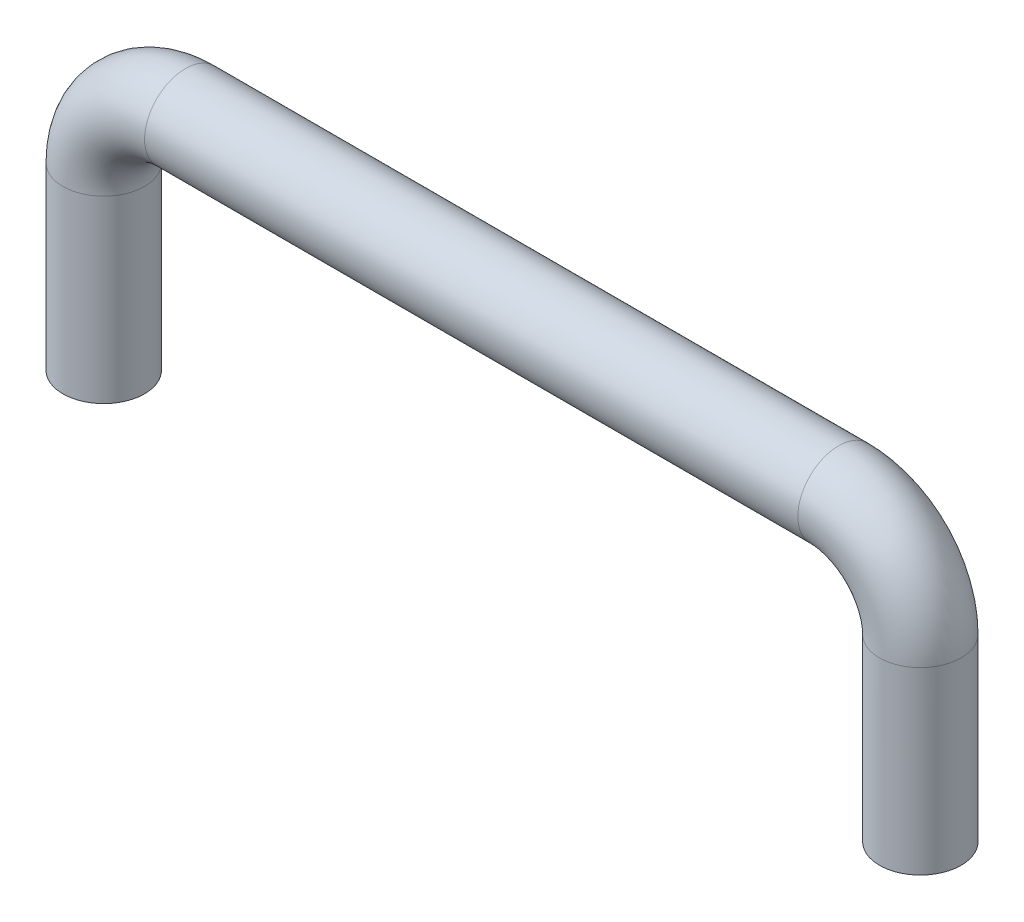
ISO-10303-21;
HEADER;
FILE_DESCRIPTION(('STEP AP214'),'2;1');
FILE_NAME('part.step','',(''),(''),'','','');
FILE_SCHEMA(('AUTOMOTIVE_DESIGN { 1 0 10303 214 1 1 1 1 }'));
ENDSEC;
DATA;
#1=APPLICATION_CONTEXT('core data for automotive mechanical design processes');
#2=APPLICATION_PROTOCOL_DEFINITION('international standard','automotive_design',2000,#1);
#3=PRODUCT_CONTEXT('',#1,'mechanical');
#4=PRODUCT('Part','Part','',(#3));
#5=PRODUCT_RELATED_PRODUCT_CATEGORY('part','',(#4));
#6=PRODUCT_DEFINITION_FORMATION('','',#4);
#7=PRODUCT_DEFINITION_CONTEXT('part definition',#1,'design');
#8=PRODUCT_DEFINITION('design','',#6,#7);
#9=PRODUCT_DEFINITION_SHAPE('','',#8);
#10=(LENGTH_UNIT() NAMED_UNIT(*) SI_UNIT(.MILLI.,.METRE.));
#11=(NAMED_UNIT(*) PLANE_ANGLE_UNIT() SI_UNIT($,.RADIAN.));
#12=(NAMED_UNIT(*) SI_UNIT($,.STERADIAN.) SOLID_ANGLE_UNIT());
#13=UNCERTAINTY_MEASURE_WITH_UNIT(LENGTH_MEASURE(1.E-05),#10,'distance_accuracy_value','');
#14=(GEOMETRIC_REPRESENTATION_CONTEXT(3) GLOBAL_UNCERTAINTY_ASSIGNED_CONTEXT((#13)) GLOBAL_UNIT_ASSIGNED_CONTEXT((#10,
#11,#12)) REPRESENTATION_CONTEXT('',''));
#15=CARTESIAN_POINT('',(0.,0.,0.));
#16=DIRECTION('',(0.,0.,1.));
#17=DIRECTION('',(1.,0.,0.));
#18=AXIS2_PLACEMENT_3D('',#15,#16,#17);
#19=CARTESIAN_POINT('',(105.,0.,0.));
#20=DIRECTION('',(0.,1.,0.));
#21=DIRECTION('',(1.,0.,0.));
#22=AXIS2_PLACEMENT_3D('',#19,#20,#21);
#23=PLANE('',#22);
#24=CARTESIAN_POINT('',(100.,0.,0.));
#25=DIRECTION('',(0.,-1.,0.));
#26=DIRECTION('',(0.,0.,-1.));
#27=AXIS2_PLACEMENT_3D('',#24,#25,#26);
#28=CIRCLE('',#27,5.);
#29=CARTESIAN_POINT('',(100.,0.,-5.));
#30=VERTEX_POINT('',#29);
#31=EDGE_CURVE('E11',#30,#30,#28,.T.);
#32=ORIENTED_EDGE('',*,*,#31,.T.);
#33=EDGE_LOOP('',(#32));
#34=FACE_BOUND('',#33,.T.);
#35=ADVANCED_FACE('F17',(#34),#23,.F.);
#36=CARTESIAN_POINT('',(100.,0.,0.));
#37=DIRECTION('',(0.,-1.,0.));
#38=DIRECTION('',(0.,0.,-1.));
#39=AXIS2_PLACEMENT_3D('',#36,#37,#38);
#40=CYLINDRICAL_SURFACE('',#39,5.);
#41=CARTESIAN_POINT('',(100.,22.,0.));
#42=DIRECTION('',(0.,1.,0.));
#43=DIRECTION('',(1.,0.,0.));
#44=AXIS2_PLACEMENT_3D('',#41,#42,#43);
#45=CIRCLE('',#44,5.);
#46=CARTESIAN_POINT('',(105.,22.,0.));
#47=VERTEX_POINT('',#46);
#48=EDGE_CURVE('E25',#47,#47,#45,.T.);
#49=ORIENTED_EDGE('',*,*,#48,.F.);
#50=EDGE_LOOP('',(#49));
#51=FACE_BOUND('',#50,.T.);
#52=ORIENTED_EDGE('',*,*,#31,.F.);
#53=EDGE_LOOP('',(#52));
#54=FACE_BOUND('',#53,.T.);
#55=ADVANCED_FACE('F137',(#51,#54),#40,.T.);
#56=CARTESIAN_POINT('',(90.,22.,0.));
#57=DIRECTION('',(0.,0.,1.));
#58=DIRECTION('',(1.,0.,0.));
#59=AXIS2_PLACEMENT_3D('',#56,#57,#58);
#60=TOROIDAL_SURFACE('',#59,10.,5.);
#61=CARTESIAN_POINT('',(90.,32.,0.));
#62=DIRECTION('',(1.,0.,0.));
#63=DIRECTION('',(0.,0.,-1.));
#64=AXIS2_PLACEMENT_3D('',#61,#62,#63);
#65=CIRCLE('',#64,5.);
#66=CARTESIAN_POINT('',(90.,32.,-5.));
#67=VERTEX_POINT('',#66);
#68=EDGE_CURVE('E73',#67,#67,#65,.T.);
#69=ORIENTED_EDGE('',*,*,#68,.T.);
#70=EDGE_LOOP('',(#69));
#71=FACE_BOUND('',#70,.T.);
#72=ORIENTED_EDGE('',*,*,#48,.T.);
#73=EDGE_LOOP('',(#72));
#74=FACE_BOUND('',#73,.T.);
#75=ADVANCED_FACE('F128',(#71,#74),#60,.T.);
#76=CARTESIAN_POINT('',(90.,32.,0.));
#77=DIRECTION('',(1.,0.,0.));
#78=DIRECTION('',(0.,0.,-1.));
#79=AXIS2_PLACEMENT_3D('',#76,#77,#78);
#80=CYLINDRICAL_SURFACE('',#79,5.);
#81=CARTESIAN_POINT('',(10.,32.,0.));
#82=DIRECTION('',(1.,0.,0.));
#83=DIRECTION('',(0.,-1.,0.));
#84=AXIS2_PLACEMENT_3D('',#81,#82,#83);
#85=CIRCLE('',#84,5.);
#86=CARTESIAN_POINT('',(10.,27.,0.));
#87=VERTEX_POINT('',#86);
#88=EDGE_CURVE('E68',#87,#87,#85,.T.);
#89=ORIENTED_EDGE('',*,*,#88,.T.);
#90=EDGE_LOOP('',(#89));
#91=FACE_BOUND('',#90,.T.);
#92=ORIENTED_EDGE('',*,*,#68,.F.);
#93=EDGE_LOOP('',(#92));
#94=FACE_BOUND('',#93,.T.);
#95=ADVANCED_FACE('F119',(#91,#94),#80,.T.);
#96=CARTESIAN_POINT('',(10.,22.,0.));
#97=DIRECTION('',(0.,0.,-1.));
#98=DIRECTION('',(-1.,0.,0.));
#99=AXIS2_PLACEMENT_3D('',#96,#97,#98);
#100=TOROIDAL_SURFACE('',#99,10.,5.);
#101=ORIENTED_EDGE('',*,*,#88,.F.);
#102=EDGE_LOOP('',(#101));
#103=FACE_BOUND('',#102,.T.);
#104=CARTESIAN_POINT('',(0.,22.,0.));
#105=DIRECTION('',(0.,-1.,0.));
#106=DIRECTION('',(0.,0.,-1.));
#107=AXIS2_PLACEMENT_3D('',#104,#105,#106);
#108=CIRCLE('',#107,5.);
#109=CARTESIAN_POINT('',(0.,22.,-5.));
#110=VERTEX_POINT('',#109);
#111=EDGE_CURVE('E62',#110,#110,#108,.T.);
#112=ORIENTED_EDGE('',*,*,#111,.F.);
#113=EDGE_LOOP('',(#112));
#114=FACE_BOUND('',#113,.T.);
#115=ADVANCED_FACE('F111',(#103,#114),#100,.T.);
#116=CARTESIAN_POINT('',(5.,0.,0.));
#117=DIRECTION('',(0.,1.,0.));
#118=DIRECTION('',(1.,0.,0.));
#119=AXIS2_PLACEMENT_3D('',#116,#117,#118);
#120=PLANE('',#119);
#121=CARTESIAN_POINT('',(0.,0.,0.));
#122=DIRECTION('',(0.,-1.,0.));
#123=DIRECTION('',(0.,0.,-1.));
#124=AXIS2_PLACEMENT_3D('',#121,#122,#123);
#125=CIRCLE('',#124,5.);
#126=CARTESIAN_POINT('',(0.,0.,-5.));
#127=VERTEX_POINT('',#126);
#128=EDGE_CURVE('E58',#127,#127,#125,.T.);
#129=ORIENTED_EDGE('',*,*,#128,.T.);
#130=EDGE_LOOP('',(#129));
#131=FACE_BOUND('',#130,.T.);
#132=ADVANCED_FACE('F59',(#131),#120,.F.);
#133=CARTESIAN_POINT('',(0.,0.,0.));
#134=DIRECTION('',(0.,-1.,0.));
#135=DIRECTION('',(0.,0.,-1.));
#136=AXIS2_PLACEMENT_3D('',#133,#134,#135);
#137=CYLINDRICAL_SURFACE('',#136,5.);
#138=ORIENTED_EDGE('',*,*,#111,.T.);
#139=EDGE_LOOP('',(#138));
#140=FACE_BOUND('',#139,.T.);
#141=ORIENTED_EDGE('',*,*,#128,.F.);
#142=EDGE_LOOP('',(#141));
#143=FACE_BOUND('',#142,.T.);
#144=ADVANCED_FACE('F97',(#140,#143),#137,.T.);
#145=CLOSED_SHELL('',(#35,#55,#75,#95,#115,#132,#144));
#146=MANIFOLD_SOLID_BREP('B1',#145);
#147=ADVANCED_BREP_SHAPE_REPRESENTATION('',(#18,#146),#14);
#148=SHAPE_DEFINITION_REPRESENTATION(#9,#147);
ENDSEC;
END-ISO-10303-21;
